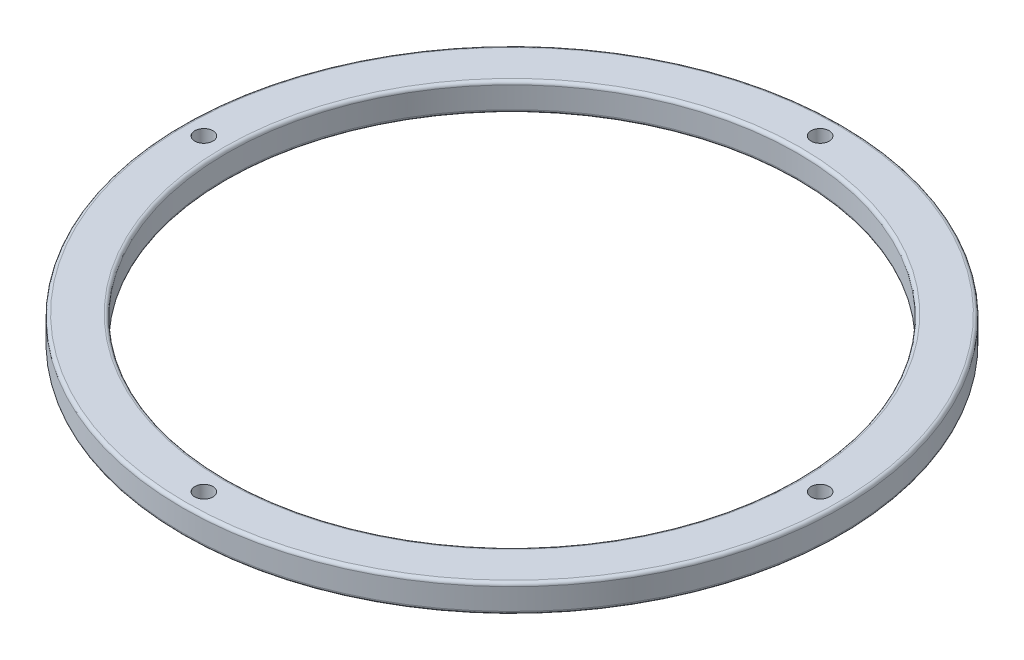
ISO-10303-21;
HEADER;
FILE_DESCRIPTION(('STEP AP214'),'2;1');
FILE_NAME('part.step','',(''),(''),'','','');
FILE_SCHEMA(('AUTOMOTIVE_DESIGN { 1 0 10303 214 1 1 1 1 }'));
ENDSEC;
DATA;
#1=APPLICATION_CONTEXT('core data for automotive mechanical design processes');
#2=APPLICATION_PROTOCOL_DEFINITION('international standard','automotive_design',2000,#1);
#3=PRODUCT_CONTEXT('',#1,'mechanical');
#4=PRODUCT('Part','Part','',(#3));
#5=PRODUCT_RELATED_PRODUCT_CATEGORY('part','',(#4));
#6=PRODUCT_DEFINITION_FORMATION('','',#4);
#7=PRODUCT_DEFINITION_CONTEXT('part definition',#1,'design');
#8=PRODUCT_DEFINITION('design','',#6,#7);
#9=PRODUCT_DEFINITION_SHAPE('','',#8);
#10=(LENGTH_UNIT() NAMED_UNIT(*) SI_UNIT(.MILLI.,.METRE.));
#11=(NAMED_UNIT(*) PLANE_ANGLE_UNIT() SI_UNIT($,.RADIAN.));
#12=(NAMED_UNIT(*) SI_UNIT($,.STERADIAN.) SOLID_ANGLE_UNIT());
#13=UNCERTAINTY_MEASURE_WITH_UNIT(LENGTH_MEASURE(1.E-05),#10,'distance_accuracy_value','');
#14=(GEOMETRIC_REPRESENTATION_CONTEXT(3) GLOBAL_UNCERTAINTY_ASSIGNED_CONTEXT((#13)) GLOBAL_UNIT_ASSIGNED_CONTEXT((#10,
#11,#12)) REPRESENTATION_CONTEXT('',''));
#15=CARTESIAN_POINT('',(0.,0.,0.));
#16=DIRECTION('',(0.,0.,1.));
#17=DIRECTION('',(1.,0.,0.));
#18=AXIS2_PLACEMENT_3D('',#15,#16,#17);
#19=CARTESIAN_POINT('',(0.,8.5,0.));
#20=DIRECTION('',(0.,1.,0.));
#21=DIRECTION('',(0.,0.,1.));
#22=AXIS2_PLACEMENT_3D('',#19,#20,#21);
#23=PLANE('',#22);
#24=CARTESIAN_POINT('',(0.,8.5,-93.5));
#25=DIRECTION('',(0.,1.,0.));
#26=DIRECTION('',(0.,0.,1.));
#27=AXIS2_PLACEMENT_3D('',#24,#25,#26);
#28=CIRCLE('',#27,2.75);
#29=CARTESIAN_POINT('',(0.,8.5,-90.75));
#30=VERTEX_POINT('',#29);
#31=EDGE_CURVE('E85',#30,#30,#28,.T.);
#32=ORIENTED_EDGE('',*,*,#31,.F.);
#33=EDGE_LOOP('',(#32));
#34=FACE_BOUND('',#33,.T.);
#35=CARTESIAN_POINT('',(93.5,8.5,0.));
#36=DIRECTION('',(0.,1.,0.));
#37=DIRECTION('',(0.,0.,1.));
#38=AXIS2_PLACEMENT_3D('',#35,#36,#37);
#39=CIRCLE('',#38,2.75000000000001);
#40=CARTESIAN_POINT('',(93.5,8.5,2.75000000000001));
#41=VERTEX_POINT('',#40);
#42=EDGE_CURVE('E79',#41,#41,#39,.T.);
#43=ORIENTED_EDGE('',*,*,#42,.F.);
#44=EDGE_LOOP('',(#43));
#45=FACE_BOUND('',#44,.T.);
#46=CARTESIAN_POINT('',(0.,8.5,93.5));
#47=DIRECTION('',(0.,1.,0.));
#48=DIRECTION('',(0.,0.,1.));
#49=AXIS2_PLACEMENT_3D('',#46,#47,#48);
#50=CIRCLE('',#49,2.75);
#51=CARTESIAN_POINT('',(0.,8.5,96.25));
#52=VERTEX_POINT('',#51);
#53=EDGE_CURVE('E73',#52,#52,#50,.T.);
#54=ORIENTED_EDGE('',*,*,#53,.F.);
#55=EDGE_LOOP('',(#54));
#56=FACE_BOUND('',#55,.T.);
#57=CARTESIAN_POINT('',(-93.5,8.5,0.));
#58=DIRECTION('',(0.,1.,0.));
#59=DIRECTION('',(0.,0.,1.));
#60=AXIS2_PLACEMENT_3D('',#57,#58,#59);
#61=CIRCLE('',#60,2.74999999999999);
#62=CARTESIAN_POINT('',(-93.5,8.5,2.74999999999999));
#63=VERTEX_POINT('',#62);
#64=EDGE_CURVE('E67',#63,#63,#61,.T.);
#65=ORIENTED_EDGE('',*,*,#64,.F.);
#66=EDGE_LOOP('',(#65));
#67=FACE_BOUND('',#66,.T.);
#68=CARTESIAN_POINT('',(0.,8.5,0.));
#69=DIRECTION('',(0.,1.,0.));
#70=DIRECTION('',(0.,0.,1.));
#71=AXIS2_PLACEMENT_3D('',#68,#69,#70);
#72=CIRCLE('',#71,87.5);
#73=CARTESIAN_POINT('',(0.,8.5,87.5));
#74=VERTEX_POINT('',#73);
#75=EDGE_CURVE('E10',#74,#74,#72,.F.);
#76=ORIENTED_EDGE('',*,*,#75,.T.);
#77=EDGE_LOOP('',(#76));
#78=FACE_BOUND('',#77,.T.);
#79=CARTESIAN_POINT('',(0.,8.5,0.));
#80=DIRECTION('',(0.,1.,0.));
#81=DIRECTION('',(0.,0.,1.));
#82=AXIS2_PLACEMENT_3D('',#79,#80,#81);
#83=CIRCLE('',#82,99.);
#84=CARTESIAN_POINT('',(0.,8.5,99.));
#85=VERTEX_POINT('',#84);
#86=EDGE_CURVE('E41',#85,#85,#83,.T.);
#87=ORIENTED_EDGE('',*,*,#86,.T.);
#88=EDGE_LOOP('',(#87));
#89=FACE_BOUND('',#88,.T.);
#90=ADVANCED_FACE('F34',(#34,#45,#56,#67,#78,#89),#23,.T.);
#91=CARTESIAN_POINT('',(0.,0.,0.));
#92=DIRECTION('',(0.,1.,0.));
#93=DIRECTION('',(0.,0.,1.));
#94=AXIS2_PLACEMENT_3D('',#91,#92,#93);
#95=PLANE('',#94);
#96=CARTESIAN_POINT('',(0.,0.,-93.5));
#97=DIRECTION('',(0.,1.,0.));
#98=DIRECTION('',(0.,0.,1.));
#99=AXIS2_PLACEMENT_3D('',#96,#97,#98);
#100=CIRCLE('',#99,2.75);
#101=CARTESIAN_POINT('',(0.,0.,-90.75));
#102=VERTEX_POINT('',#101);
#103=EDGE_CURVE('E66',#102,#102,#100,.T.);
#104=ORIENTED_EDGE('',*,*,#103,.T.);
#105=EDGE_LOOP('',(#104));
#106=FACE_BOUND('',#105,.T.);
#107=CARTESIAN_POINT('',(93.5,0.,0.));
#108=DIRECTION('',(0.,1.,0.));
#109=DIRECTION('',(0.,0.,1.));
#110=AXIS2_PLACEMENT_3D('',#107,#108,#109);
#111=CIRCLE('',#110,2.75000000000001);
#112=CARTESIAN_POINT('',(93.5,0.,2.75000000000001));
#113=VERTEX_POINT('',#112);
#114=EDGE_CURVE('E82',#113,#113,#111,.T.);
#115=ORIENTED_EDGE('',*,*,#114,.T.);
#116=EDGE_LOOP('',(#115));
#117=FACE_BOUND('',#116,.T.);
#118=CARTESIAN_POINT('',(0.,0.,93.5));
#119=DIRECTION('',(0.,1.,0.));
#120=DIRECTION('',(0.,0.,1.));
#121=AXIS2_PLACEMENT_3D('',#118,#119,#120);
#122=CIRCLE('',#121,2.75);
#123=CARTESIAN_POINT('',(0.,0.,96.25));
#124=VERTEX_POINT('',#123);
#125=EDGE_CURVE('E76',#124,#124,#122,.T.);
#126=ORIENTED_EDGE('',*,*,#125,.T.);
#127=EDGE_LOOP('',(#126));
#128=FACE_BOUND('',#127,.T.);
#129=CARTESIAN_POINT('',(-93.5,0.,0.));
#130=DIRECTION('',(0.,1.,0.));
#131=DIRECTION('',(0.,0.,1.));
#132=AXIS2_PLACEMENT_3D('',#129,#130,#131);
#133=CIRCLE('',#132,2.74999999999999);
#134=CARTESIAN_POINT('',(-93.5,0.,2.74999999999999));
#135=VERTEX_POINT('',#134);
#136=EDGE_CURVE('E70',#135,#135,#133,.T.);
#137=ORIENTED_EDGE('',*,*,#136,.T.);
#138=EDGE_LOOP('',(#137));
#139=FACE_BOUND('',#138,.T.);
#140=CARTESIAN_POINT('',(0.,0.,0.));
#141=DIRECTION('',(0.,1.,0.));
#142=DIRECTION('',(0.,0.,1.));
#143=AXIS2_PLACEMENT_3D('',#140,#141,#142);
#144=CIRCLE('',#143,87.5);
#145=CARTESIAN_POINT('',(0.,0.,87.5));
#146=VERTEX_POINT('',#145);
#147=EDGE_CURVE('E60',#146,#146,#144,.T.);
#148=ORIENTED_EDGE('',*,*,#147,.T.);
#149=EDGE_LOOP('',(#148));
#150=FACE_BOUND('',#149,.T.);
#151=CARTESIAN_POINT('',(0.,0.,0.));
#152=DIRECTION('',(0.,1.,0.));
#153=DIRECTION('',(0.,0.,1.));
#154=AXIS2_PLACEMENT_3D('',#151,#152,#153);
#155=CIRCLE('',#154,99.);
#156=CARTESIAN_POINT('',(0.,0.,99.));
#157=VERTEX_POINT('',#156);
#158=EDGE_CURVE('E63',#157,#157,#155,.F.);
#159=ORIENTED_EDGE('',*,*,#158,.T.);
#160=EDGE_LOOP('',(#159));
#161=FACE_BOUND('',#160,.T.);
#162=ADVANCED_FACE('F91',(#106,#117,#128,#139,#150,#161),#95,.F.);
#163=CARTESIAN_POINT('',(0.,8.5,0.));
#164=DIRECTION('',(0.,-1.,0.));
#165=DIRECTION('',(0.,0.,-1.));
#166=AXIS2_PLACEMENT_3D('',#163,#164,#165);
#167=CYLINDRICAL_SURFACE('',#166,100.);
#168=CARTESIAN_POINT('',(0.,1.,0.));
#169=DIRECTION('',(0.,1.,0.));
#170=DIRECTION('',(0.,0.,1.));
#171=AXIS2_PLACEMENT_3D('',#168,#169,#170);
#172=CIRCLE('',#171,100.);
#173=CARTESIAN_POINT('',(0.,1.,100.));
#174=VERTEX_POINT('',#173);
#175=EDGE_CURVE('E45',#174,#174,#172,.T.);
#176=ORIENTED_EDGE('',*,*,#175,.T.);
#177=EDGE_LOOP('',(#176));
#178=FACE_BOUND('',#177,.T.);
#179=CARTESIAN_POINT('',(0.,7.5,0.));
#180=DIRECTION('',(0.,1.,0.));
#181=DIRECTION('',(0.,0.,1.));
#182=AXIS2_PLACEMENT_3D('',#179,#180,#181);
#183=CIRCLE('',#182,100.);
#184=CARTESIAN_POINT('',(0.,7.5,100.));
#185=VERTEX_POINT('',#184);
#186=EDGE_CURVE('E49',#185,#185,#183,.F.);
#187=ORIENTED_EDGE('',*,*,#186,.T.);
#188=EDGE_LOOP('',(#187));
#189=FACE_BOUND('',#188,.T.);
#190=ADVANCED_FACE('F129',(#178,#189),#167,.T.);
#191=CARTESIAN_POINT('',(0.,8.5,0.));
#192=DIRECTION('',(0.,-1.,0.));
#193=DIRECTION('',(0.,0.,-1.));
#194=AXIS2_PLACEMENT_3D('',#191,#192,#193);
#195=CYLINDRICAL_SURFACE('',#194,86.5);
#196=CARTESIAN_POINT('',(0.,1.,0.));
#197=DIRECTION('',(0.,1.,0.));
#198=DIRECTION('',(0.,0.,1.));
#199=AXIS2_PLACEMENT_3D('',#196,#197,#198);
#200=CIRCLE('',#199,86.5);
#201=CARTESIAN_POINT('',(0.,1.,86.5));
#202=VERTEX_POINT('',#201);
#203=EDGE_CURVE('E54',#202,#202,#200,.F.);
#204=ORIENTED_EDGE('',*,*,#203,.T.);
#205=EDGE_LOOP('',(#204));
#206=FACE_BOUND('',#205,.T.);
#207=CARTESIAN_POINT('',(0.,7.5,0.));
#208=DIRECTION('',(0.,1.,0.));
#209=DIRECTION('',(0.,0.,1.));
#210=AXIS2_PLACEMENT_3D('',#207,#208,#209);
#211=CIRCLE('',#210,86.5);
#212=CARTESIAN_POINT('',(0.,7.5,86.5));
#213=VERTEX_POINT('',#212);
#214=EDGE_CURVE('E57',#213,#213,#211,.T.);
#215=ORIENTED_EDGE('',*,*,#214,.T.);
#216=EDGE_LOOP('',(#215));
#217=FACE_BOUND('',#216,.T.);
#218=ADVANCED_FACE('F126',(#206,#217),#195,.F.);
#219=CARTESIAN_POINT('',(0.,1.,0.));
#220=DIRECTION('',(0.,1.,0.));
#221=DIRECTION('',(0.,0.,1.));
#222=AXIS2_PLACEMENT_3D('',#219,#220,#221);
#223=TOROIDAL_SURFACE('',#222,87.5,1.);
#224=ORIENTED_EDGE('',*,*,#203,.F.);
#225=EDGE_LOOP('',(#224));
#226=FACE_BOUND('',#225,.T.);
#227=ORIENTED_EDGE('',*,*,#147,.F.);
#228=EDGE_LOOP('',(#227));
#229=FACE_BOUND('',#228,.T.);
#230=ADVANCED_FACE('F128',(#226,#229),#223,.T.);
#231=CARTESIAN_POINT('',(0.,1.,0.));
#232=DIRECTION('',(0.,1.,0.));
#233=DIRECTION('',(0.,0.,1.));
#234=AXIS2_PLACEMENT_3D('',#231,#232,#233);
#235=TOROIDAL_SURFACE('',#234,99.,1.);
#236=ORIENTED_EDGE('',*,*,#158,.F.);
#237=EDGE_LOOP('',(#236));
#238=FACE_BOUND('',#237,.T.);
#239=ORIENTED_EDGE('',*,*,#175,.F.);
#240=EDGE_LOOP('',(#239));
#241=FACE_BOUND('',#240,.T.);
#242=ADVANCED_FACE('F139',(#238,#241),#235,.T.);
#243=CARTESIAN_POINT('',(0.,7.5,0.));
#244=DIRECTION('',(0.,1.,0.));
#245=DIRECTION('',(0.,0.,1.));
#246=AXIS2_PLACEMENT_3D('',#243,#244,#245);
#247=TOROIDAL_SURFACE('',#246,87.5,1.);
#248=ORIENTED_EDGE('',*,*,#75,.F.);
#249=EDGE_LOOP('',(#248));
#250=FACE_BOUND('',#249,.T.);
#251=ORIENTED_EDGE('',*,*,#214,.F.);
#252=EDGE_LOOP('',(#251));
#253=FACE_BOUND('',#252,.T.);
#254=ADVANCED_FACE('F121',(#250,#253),#247,.T.);
#255=CARTESIAN_POINT('',(0.,7.5,0.));
#256=DIRECTION('',(0.,1.,0.));
#257=DIRECTION('',(0.,0.,1.));
#258=AXIS2_PLACEMENT_3D('',#255,#256,#257);
#259=TOROIDAL_SURFACE('',#258,99.,1.);
#260=ORIENTED_EDGE('',*,*,#186,.F.);
#261=EDGE_LOOP('',(#260));
#262=FACE_BOUND('',#261,.T.);
#263=ORIENTED_EDGE('',*,*,#86,.F.);
#264=EDGE_LOOP('',(#263));
#265=FACE_BOUND('',#264,.T.);
#266=ADVANCED_FACE('F36',(#262,#265),#259,.T.);
#267=CARTESIAN_POINT('',(-93.5,0.,0.));
#268=DIRECTION('',(0.,1.,0.));
#269=DIRECTION('',(0.,0.,1.));
#270=AXIS2_PLACEMENT_3D('',#267,#268,#269);
#271=CYLINDRICAL_SURFACE('',#270,2.74999999999999);
#272=ORIENTED_EDGE('',*,*,#136,.F.);
#273=EDGE_LOOP('',(#272));
#274=FACE_BOUND('',#273,.T.);
#275=ORIENTED_EDGE('',*,*,#64,.T.);
#276=EDGE_LOOP('',(#275));
#277=FACE_BOUND('',#276,.T.);
#278=ADVANCED_FACE('F110',(#274,#277),#271,.F.);
#279=CARTESIAN_POINT('',(0.,0.,93.5));
#280=DIRECTION('',(0.,1.,0.));
#281=DIRECTION('',(0.,0.,1.));
#282=AXIS2_PLACEMENT_3D('',#279,#280,#281);
#283=CYLINDRICAL_SURFACE('',#282,2.75);
#284=ORIENTED_EDGE('',*,*,#125,.F.);
#285=EDGE_LOOP('',(#284));
#286=FACE_BOUND('',#285,.T.);
#287=ORIENTED_EDGE('',*,*,#53,.T.);
#288=EDGE_LOOP('',(#287));
#289=FACE_BOUND('',#288,.T.);
#290=ADVANCED_FACE('F112',(#286,#289),#283,.F.);
#291=CARTESIAN_POINT('',(93.5,0.,0.));
#292=DIRECTION('',(0.,1.,0.));
#293=DIRECTION('',(0.,0.,1.));
#294=AXIS2_PLACEMENT_3D('',#291,#292,#293);
#295=CYLINDRICAL_SURFACE('',#294,2.75000000000001);
#296=ORIENTED_EDGE('',*,*,#114,.F.);
#297=EDGE_LOOP('',(#296));
#298=FACE_BOUND('',#297,.T.);
#299=ORIENTED_EDGE('',*,*,#42,.T.);
#300=EDGE_LOOP('',(#299));
#301=FACE_BOUND('',#300,.T.);
#302=ADVANCED_FACE('F97',(#298,#301),#295,.F.);
#303=CARTESIAN_POINT('',(0.,0.,-93.5));
#304=DIRECTION('',(0.,1.,0.));
#305=DIRECTION('',(0.,0.,1.));
#306=AXIS2_PLACEMENT_3D('',#303,#304,#305);
#307=CYLINDRICAL_SURFACE('',#306,2.75);
#308=ORIENTED_EDGE('',*,*,#103,.F.);
#309=EDGE_LOOP('',(#308));
#310=FACE_BOUND('',#309,.T.);
#311=ORIENTED_EDGE('',*,*,#31,.T.);
#312=EDGE_LOOP('',(#311));
#313=FACE_BOUND('',#312,.T.);
#314=ADVANCED_FACE('F94',(#310,#313),#307,.F.);
#315=CLOSED_SHELL('',(#90,#162,#190,#218,#230,#242,#254,#266,#278,#290,#302,#314));
#316=MANIFOLD_SOLID_BREP('B2',#315);
#317=ADVANCED_BREP_SHAPE_REPRESENTATION('',(#18,#316),#14);
#318=SHAPE_DEFINITION_REPRESENTATION(#9,#317);
ENDSEC;
END-ISO-10303-21;
